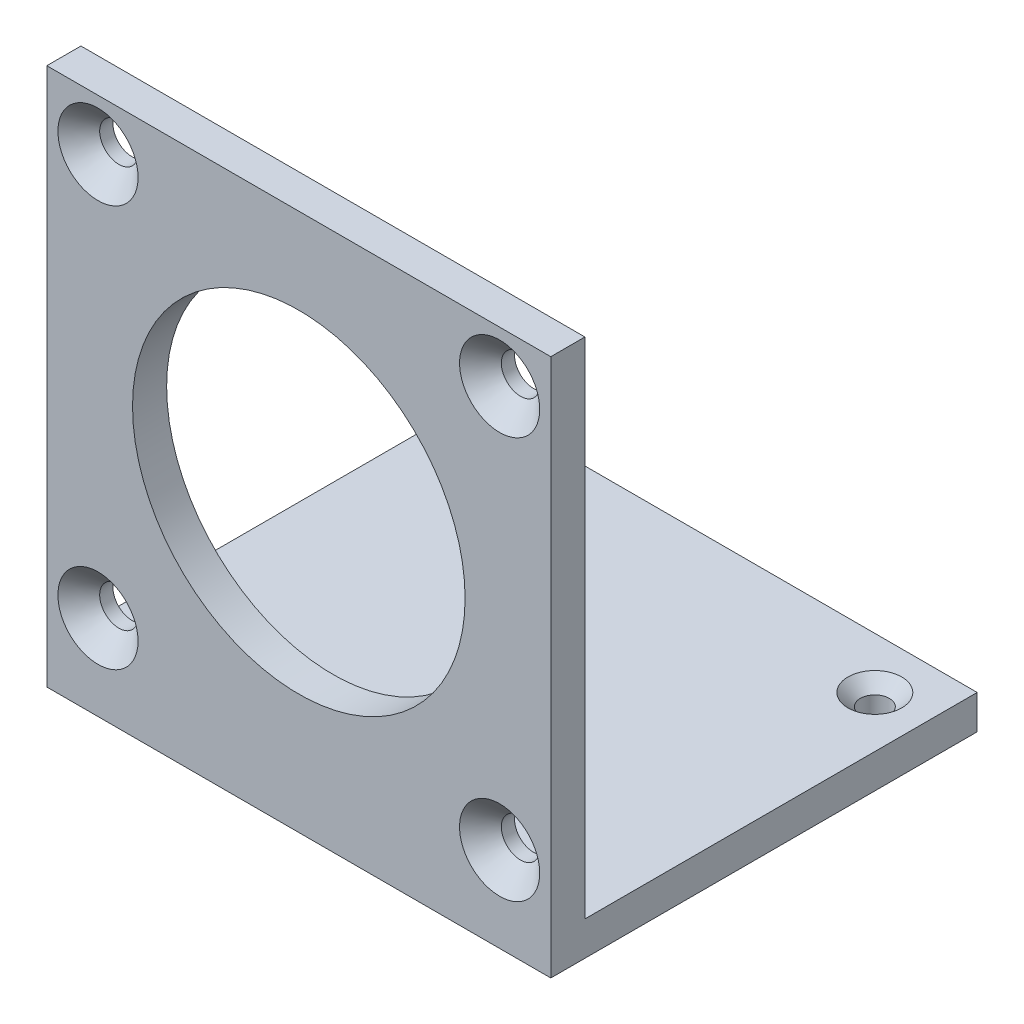
ISO-10303-21;
HEADER;
FILE_DESCRIPTION(('STEP AP214'),'2;1');
FILE_NAME('part.step','',(''),(''),'','','');
FILE_SCHEMA(('AUTOMOTIVE_DESIGN { 1 0 10303 214 1 1 1 1 }'));
ENDSEC;
DATA;
#1=APPLICATION_CONTEXT('core data for automotive mechanical design processes');
#2=APPLICATION_PROTOCOL_DEFINITION('international standard','automotive_design',2000,#1);
#3=PRODUCT_CONTEXT('',#1,'mechanical');
#4=PRODUCT('Part','Part','',(#3));
#5=PRODUCT_RELATED_PRODUCT_CATEGORY('part','',(#4));
#6=PRODUCT_DEFINITION_FORMATION('','',#4);
#7=PRODUCT_DEFINITION_CONTEXT('part definition',#1,'design');
#8=PRODUCT_DEFINITION('design','',#6,#7);
#9=PRODUCT_DEFINITION_SHAPE('','',#8);
#10=(LENGTH_UNIT() NAMED_UNIT(*) SI_UNIT(.MILLI.,.METRE.));
#11=(NAMED_UNIT(*) PLANE_ANGLE_UNIT() SI_UNIT($,.RADIAN.));
#12=(NAMED_UNIT(*) SI_UNIT($,.STERADIAN.) SOLID_ANGLE_UNIT());
#13=UNCERTAINTY_MEASURE_WITH_UNIT(LENGTH_MEASURE(1.E-05),#10,'distance_accuracy_value','');
#14=(GEOMETRIC_REPRESENTATION_CONTEXT(3) GLOBAL_UNCERTAINTY_ASSIGNED_CONTEXT((#13)) GLOBAL_UNIT_ASSIGNED_CONTEXT((#10,
#11,#12)) REPRESENTATION_CONTEXT('',''));
#15=CARTESIAN_POINT('',(0.,0.,0.));
#16=DIRECTION('',(0.,0.,1.));
#17=DIRECTION('',(1.,0.,0.));
#18=AXIS2_PLACEMENT_3D('',#15,#16,#17);
#19=CARTESIAN_POINT('',(0.,-10.,0.));
#20=DIRECTION('',(0.,-1.,0.));
#21=DIRECTION('',(0.,0.,-1.));
#22=AXIS2_PLACEMENT_3D('',#19,#20,#21);
#23=PLANE('',#22);
#24=CARTESIAN_POINT('',(47.1,-10.,-40.));
#25=DIRECTION('',(0.,1.,0.));
#26=DIRECTION('',(0.,0.,1.));
#27=AXIS2_PLACEMENT_3D('',#24,#25,#26);
#28=CIRCLE('',#27,1.7);
#29=CARTESIAN_POINT('',(47.1,-10.,-38.3));
#30=VERTEX_POINT('',#29);
#31=EDGE_CURVE('E145',#30,#30,#28,.T.);
#32=ORIENTED_EDGE('',*,*,#31,.T.);
#33=EDGE_LOOP('',(#32));
#34=FACE_BOUND('',#33,.T.);
#35=CARTESIAN_POINT('',(23.55,-10.,-18.));
#36=DIRECTION('',(0.,1.,0.));
#37=DIRECTION('',(0.,0.,1.));
#38=AXIS2_PLACEMENT_3D('',#35,#36,#37);
#39=CIRCLE('',#38,1.7);
#40=CARTESIAN_POINT('',(23.55,-10.,-16.3));
#41=VERTEX_POINT('',#40);
#42=EDGE_CURVE('E154',#41,#41,#39,.T.);
#43=ORIENTED_EDGE('',*,*,#42,.T.);
#44=EDGE_LOOP('',(#43));
#45=FACE_BOUND('',#44,.T.);
#46=DIRECTION('',(0.,0.,-1.));
#47=VECTOR('',#46,1.);
#48=CARTESIAN_POINT('',(-6.,-10.,4.));
#49=LINE('',#48,#47);
#50=CARTESIAN_POINT('',(-6.,-10.,4.));
#51=VERTEX_POINT('',#50);
#52=CARTESIAN_POINT('',(-5.99999999999999,-10.,-46.));
#53=VERTEX_POINT('',#52);
#54=EDGE_CURVE('E158',#51,#53,#49,.T.);
#55=ORIENTED_EDGE('',*,*,#54,.T.);
#56=DIRECTION('',(1.,0.,0.));
#57=VECTOR('',#56,1.);
#58=CARTESIAN_POINT('',(-5.99999999999999,-10.,-46.));
#59=LINE('',#58,#57);
#60=CARTESIAN_POINT('',(53.1,-10.,-46.));
#61=VERTEX_POINT('',#60);
#62=EDGE_CURVE('E161',#53,#61,#59,.T.);
#63=ORIENTED_EDGE('',*,*,#62,.T.);
#64=DIRECTION('',(0.,0.,1.));
#65=VECTOR('',#64,1.);
#66=CARTESIAN_POINT('',(53.1,-10.,4.));
#67=LINE('',#66,#65);
#68=CARTESIAN_POINT('',(53.1,-10.,4.));
#69=VERTEX_POINT('',#68);
#70=EDGE_CURVE('E165',#61,#69,#67,.T.);
#71=ORIENTED_EDGE('',*,*,#70,.T.);
#72=DIRECTION('',(-1.,0.,0.));
#73=VECTOR('',#72,1.);
#74=CARTESIAN_POINT('',(-6.,-10.,4.));
#75=LINE('',#74,#73);
#76=EDGE_CURVE('E168',#69,#51,#75,.T.);
#77=ORIENTED_EDGE('',*,*,#76,.T.);
#78=EDGE_LOOP('',(#55,#63,#71,#77));
#79=FACE_BOUND('',#78,.T.);
#80=CARTESIAN_POINT('',(0.,-10.,-40.));
#81=DIRECTION('',(0.,1.,0.));
#82=DIRECTION('',(0.,0.,1.));
#83=AXIS2_PLACEMENT_3D('',#80,#81,#82);
#84=CIRCLE('',#83,1.7);
#85=CARTESIAN_POINT('',(0.,-10.,-38.3));
#86=VERTEX_POINT('',#85);
#87=EDGE_CURVE('E136',#86,#86,#84,.T.);
#88=ORIENTED_EDGE('',*,*,#87,.T.);
#89=EDGE_LOOP('',(#88));
#90=FACE_BOUND('',#89,.T.);
#91=ADVANCED_FACE('F33',(#34,#45,#79,#90),#23,.T.);
#92=CARTESIAN_POINT('',(0.,0.,4.));
#93=DIRECTION('',(0.,0.,-1.));
#94=DIRECTION('',(-1.,0.,0.));
#95=AXIS2_PLACEMENT_3D('',#92,#93,#94);
#96=PLANE('',#95);
#97=CARTESIAN_POINT('',(0.,47.1,4.));
#98=DIRECTION('',(0.,0.,1.));
#99=DIRECTION('',(1.,0.,0.));
#100=AXIS2_PLACEMENT_3D('',#97,#98,#99);
#101=CIRCLE('',#100,4.7);
#102=CARTESIAN_POINT('',(4.7,47.1,4.));
#103=VERTEX_POINT('',#102);
#104=EDGE_CURVE('E461',#103,#103,#101,.T.);
#105=ORIENTED_EDGE('',*,*,#104,.F.);
#106=EDGE_LOOP('',(#105));
#107=FACE_BOUND('',#106,.T.);
#108=CARTESIAN_POINT('',(47.1,47.1,4.));
#109=DIRECTION('',(0.,0.,1.));
#110=DIRECTION('',(1.,0.,0.));
#111=AXIS2_PLACEMENT_3D('',#108,#109,#110);
#112=CIRCLE('',#111,4.7);
#113=CARTESIAN_POINT('',(51.8,47.1,4.));
#114=VERTEX_POINT('',#113);
#115=EDGE_CURVE('E117',#114,#114,#112,.T.);
#116=ORIENTED_EDGE('',*,*,#115,.F.);
#117=EDGE_LOOP('',(#116));
#118=FACE_BOUND('',#117,.T.);
#119=CARTESIAN_POINT('',(47.1,0.,4.));
#120=DIRECTION('',(0.,0.,1.));
#121=DIRECTION('',(1.,0.,0.));
#122=AXIS2_PLACEMENT_3D('',#119,#120,#121);
#123=CIRCLE('',#122,4.7);
#124=CARTESIAN_POINT('',(51.8,0.,4.));
#125=VERTEX_POINT('',#124);
#126=EDGE_CURVE('E110',#125,#125,#123,.T.);
#127=ORIENTED_EDGE('',*,*,#126,.F.);
#128=EDGE_LOOP('',(#127));
#129=FACE_BOUND('',#128,.T.);
#130=CARTESIAN_POINT('',(0.,0.,4.));
#131=DIRECTION('',(0.,0.,1.));
#132=DIRECTION('',(1.,0.,0.));
#133=AXIS2_PLACEMENT_3D('',#130,#131,#132);
#134=CIRCLE('',#133,4.7);
#135=CARTESIAN_POINT('',(4.7,0.,4.));
#136=VERTEX_POINT('',#135);
#137=EDGE_CURVE('E106',#136,#136,#134,.T.);
#138=ORIENTED_EDGE('',*,*,#137,.F.);
#139=EDGE_LOOP('',(#138));
#140=FACE_BOUND('',#139,.T.);
#141=DIRECTION('',(0.,-1.,0.));
#142=VECTOR('',#141,1.);
#143=CARTESIAN_POINT('',(-6.,-6.,4.));
#144=LINE('',#143,#142);
#145=CARTESIAN_POINT('',(-6.,53.1,4.));
#146=VERTEX_POINT('',#145);
#147=EDGE_CURVE('E76',#146,#51,#144,.T.);
#148=ORIENTED_EDGE('',*,*,#147,.T.);
#149=ORIENTED_EDGE('',*,*,#76,.F.);
#150=DIRECTION('',(0.,1.,0.));
#151=VECTOR('',#150,1.);
#152=CARTESIAN_POINT('',(53.1,-6.,4.));
#153=LINE('',#152,#151);
#154=CARTESIAN_POINT('',(53.1,53.1,4.));
#155=VERTEX_POINT('',#154);
#156=EDGE_CURVE('E184',#69,#155,#153,.T.);
#157=ORIENTED_EDGE('',*,*,#156,.T.);
#158=DIRECTION('',(-1.,0.,0.));
#159=VECTOR('',#158,1.);
#160=CARTESIAN_POINT('',(-6.,53.1,4.));
#161=LINE('',#160,#159);
#162=EDGE_CURVE('E52',#155,#146,#161,.T.);
#163=ORIENTED_EDGE('',*,*,#162,.T.);
#164=EDGE_LOOP('',(#148,#149,#157,#163));
#165=FACE_BOUND('',#164,.T.);
#166=CARTESIAN_POINT('',(23.55,23.55,4.));
#167=DIRECTION('',(0.,0.,1.));
#168=DIRECTION('',(1.,0.,0.));
#169=AXIS2_PLACEMENT_3D('',#166,#167,#168);
#170=CIRCLE('',#169,19.5);
#171=CARTESIAN_POINT('',(43.05,23.55,4.));
#172=VERTEX_POINT('',#171);
#173=EDGE_CURVE('E89',#172,#172,#170,.T.);
#174=ORIENTED_EDGE('',*,*,#173,.F.);
#175=EDGE_LOOP('',(#174));
#176=FACE_BOUND('',#175,.T.);
#177=ADVANCED_FACE('F187',(#107,#118,#129,#140,#165,#176),#96,.F.);
#178=CARTESIAN_POINT('',(0.,0.,0.));
#179=DIRECTION('',(0.,0.,-1.));
#180=DIRECTION('',(-1.,0.,0.));
#181=AXIS2_PLACEMENT_3D('',#178,#179,#180);
#182=PLANE('',#181);
#183=CARTESIAN_POINT('',(0.,47.1,0.));
#184=DIRECTION('',(0.,0.,-1.));
#185=DIRECTION('',(-1.,0.,0.));
#186=AXIS2_PLACEMENT_3D('',#183,#184,#185);
#187=CIRCLE('',#186,2.24999999999999);
#188=CARTESIAN_POINT('',(-2.24999999999999,47.1,0.));
#189=VERTEX_POINT('',#188);
#190=EDGE_CURVE('E37',#189,#189,#187,.T.);
#191=ORIENTED_EDGE('',*,*,#190,.F.);
#192=EDGE_LOOP('',(#191));
#193=FACE_BOUND('',#192,.T.);
#194=CARTESIAN_POINT('',(47.1,47.1,0.));
#195=DIRECTION('',(0.,0.,-1.));
#196=DIRECTION('',(-1.,0.,0.));
#197=AXIS2_PLACEMENT_3D('',#194,#195,#196);
#198=CIRCLE('',#197,2.24999999999999);
#199=CARTESIAN_POINT('',(44.85,47.1,0.));
#200=VERTEX_POINT('',#199);
#201=EDGE_CURVE('E108',#200,#200,#198,.T.);
#202=ORIENTED_EDGE('',*,*,#201,.F.);
#203=EDGE_LOOP('',(#202));
#204=FACE_BOUND('',#203,.T.);
#205=CARTESIAN_POINT('',(47.1,0.,0.));
#206=DIRECTION('',(0.,0.,-1.));
#207=DIRECTION('',(-1.,0.,0.));
#208=AXIS2_PLACEMENT_3D('',#205,#206,#207);
#209=CIRCLE('',#208,2.24999999999999);
#210=CARTESIAN_POINT('',(44.85,0.,0.));
#211=VERTEX_POINT('',#210);
#212=EDGE_CURVE('E104',#211,#211,#209,.T.);
#213=ORIENTED_EDGE('',*,*,#212,.F.);
#214=EDGE_LOOP('',(#213));
#215=FACE_BOUND('',#214,.T.);
#216=CARTESIAN_POINT('',(0.,0.,0.));
#217=DIRECTION('',(0.,0.,-1.));
#218=DIRECTION('',(-1.,0.,0.));
#219=AXIS2_PLACEMENT_3D('',#216,#217,#218);
#220=CIRCLE('',#219,2.24999999999999);
#221=CARTESIAN_POINT('',(-2.24999999999999,0.,0.));
#222=VERTEX_POINT('',#221);
#223=EDGE_CURVE('E99',#222,#222,#220,.T.);
#224=ORIENTED_EDGE('',*,*,#223,.F.);
#225=EDGE_LOOP('',(#224));
#226=FACE_BOUND('',#225,.T.);
#227=DIRECTION('',(0.,-1.,0.));
#228=VECTOR('',#227,1.);
#229=CARTESIAN_POINT('',(-6.,-6.,0.));
#230=LINE('',#229,#228);
#231=CARTESIAN_POINT('',(-6.,53.1,0.));
#232=VERTEX_POINT('',#231);
#233=CARTESIAN_POINT('',(-6.,-6.,0.));
#234=VERTEX_POINT('',#233);
#235=EDGE_CURVE('E81',#232,#234,#230,.T.);
#236=ORIENTED_EDGE('',*,*,#235,.F.);
#237=DIRECTION('',(-1.,0.,0.));
#238=VECTOR('',#237,1.);
#239=CARTESIAN_POINT('',(-6.,53.1,0.));
#240=LINE('',#239,#238);
#241=CARTESIAN_POINT('',(53.1,53.1,0.));
#242=VERTEX_POINT('',#241);
#243=EDGE_CURVE('E70',#242,#232,#240,.T.);
#244=ORIENTED_EDGE('',*,*,#243,.F.);
#245=DIRECTION('',(0.,1.,0.));
#246=VECTOR('',#245,1.);
#247=CARTESIAN_POINT('',(53.1,-6.,0.));
#248=LINE('',#247,#246);
#249=CARTESIAN_POINT('',(53.1,-6.,0.));
#250=VERTEX_POINT('',#249);
#251=EDGE_CURVE('E66',#250,#242,#248,.T.);
#252=ORIENTED_EDGE('',*,*,#251,.F.);
#253=DIRECTION('',(1.,0.,0.));
#254=VECTOR('',#253,1.);
#255=CARTESIAN_POINT('',(-6.,-6.,0.));
#256=LINE('',#255,#254);
#257=EDGE_CURVE('E88',#234,#250,#256,.T.);
#258=ORIENTED_EDGE('',*,*,#257,.F.);
#259=EDGE_LOOP('',(#236,#244,#252,#258));
#260=FACE_BOUND('',#259,.T.);
#261=CARTESIAN_POINT('',(23.55,23.55,0.));
#262=DIRECTION('',(0.,0.,1.));
#263=DIRECTION('',(1.,0.,0.));
#264=AXIS2_PLACEMENT_3D('',#261,#262,#263);
#265=CIRCLE('',#264,19.5);
#266=CARTESIAN_POINT('',(43.05,23.55,0.));
#267=VERTEX_POINT('',#266);
#268=EDGE_CURVE('E93',#267,#267,#265,.T.);
#269=ORIENTED_EDGE('',*,*,#268,.T.);
#270=EDGE_LOOP('',(#269));
#271=FACE_BOUND('',#270,.T.);
#272=ADVANCED_FACE('F85',(#193,#204,#215,#226,#260,#271),#182,.T.);
#273=CARTESIAN_POINT('',(-6.,-6.,4.));
#274=DIRECTION('',(1.,0.,0.));
#275=DIRECTION('',(0.,0.,-1.));
#276=AXIS2_PLACEMENT_3D('',#273,#274,#275);
#277=PLANE('',#276);
#278=ORIENTED_EDGE('',*,*,#235,.T.);
#279=DIRECTION('',(0.,0.,-1.));
#280=VECTOR('',#279,1.);
#281=CARTESIAN_POINT('',(-6.,-6.,4.));
#282=LINE('',#281,#280);
#283=CARTESIAN_POINT('',(-5.99999999999999,-6.,-46.));
#284=VERTEX_POINT('',#283);
#285=EDGE_CURVE('E157',#234,#284,#282,.T.);
#286=ORIENTED_EDGE('',*,*,#285,.T.);
#287=DIRECTION('',(0.,1.,0.));
#288=VECTOR('',#287,1.);
#289=CARTESIAN_POINT('',(-5.99999999999999,-10.,-46.));
#290=LINE('',#289,#288);
#291=EDGE_CURVE('E179',#53,#284,#290,.T.);
#292=ORIENTED_EDGE('',*,*,#291,.F.);
#293=ORIENTED_EDGE('',*,*,#54,.F.);
#294=ORIENTED_EDGE('',*,*,#147,.F.);
#295=DIRECTION('',(0.,0.,-1.));
#296=VECTOR('',#295,1.);
#297=CARTESIAN_POINT('',(-6.,53.1,4.));
#298=LINE('',#297,#296);
#299=EDGE_CURVE('E43',#146,#232,#298,.T.);
#300=ORIENTED_EDGE('',*,*,#299,.T.);
#301=EDGE_LOOP('',(#278,#286,#292,#293,#294,#300));
#302=FACE_BOUND('',#301,.T.);
#303=ADVANCED_FACE('F35',(#302),#277,.F.);
#304=CARTESIAN_POINT('',(53.1,-6.,4.));
#305=DIRECTION('',(-1.,0.,0.));
#306=DIRECTION('',(0.,0.,1.));
#307=AXIS2_PLACEMENT_3D('',#304,#305,#306);
#308=PLANE('',#307);
#309=ORIENTED_EDGE('',*,*,#251,.T.);
#310=DIRECTION('',(0.,0.,-1.));
#311=VECTOR('',#310,1.);
#312=CARTESIAN_POINT('',(53.1,53.1,4.));
#313=LINE('',#312,#311);
#314=EDGE_CURVE('E11',#155,#242,#313,.T.);
#315=ORIENTED_EDGE('',*,*,#314,.F.);
#316=ORIENTED_EDGE('',*,*,#156,.F.);
#317=ORIENTED_EDGE('',*,*,#70,.F.);
#318=DIRECTION('',(0.,1.,0.));
#319=VECTOR('',#318,1.);
#320=CARTESIAN_POINT('',(53.1,-10.,-46.));
#321=LINE('',#320,#319);
#322=CARTESIAN_POINT('',(53.1,-6.,-46.));
#323=VERTEX_POINT('',#322);
#324=EDGE_CURVE('E171',#61,#323,#321,.T.);
#325=ORIENTED_EDGE('',*,*,#324,.T.);
#326=DIRECTION('',(0.,0.,1.));
#327=VECTOR('',#326,1.);
#328=CARTESIAN_POINT('',(53.1,-6.,4.));
#329=LINE('',#328,#327);
#330=EDGE_CURVE('E162',#323,#250,#329,.T.);
#331=ORIENTED_EDGE('',*,*,#330,.T.);
#332=EDGE_LOOP('',(#309,#315,#316,#317,#325,#331));
#333=FACE_BOUND('',#332,.T.);
#334=ADVANCED_FACE('F191',(#333),#308,.F.);
#335=CARTESIAN_POINT('',(-6.,53.1,4.));
#336=DIRECTION('',(0.,-1.,0.));
#337=DIRECTION('',(0.,0.,-1.));
#338=AXIS2_PLACEMENT_3D('',#335,#336,#337);
#339=PLANE('',#338);
#340=ORIENTED_EDGE('',*,*,#243,.T.);
#341=ORIENTED_EDGE('',*,*,#299,.F.);
#342=ORIENTED_EDGE('',*,*,#162,.F.);
#343=ORIENTED_EDGE('',*,*,#314,.T.);
#344=EDGE_LOOP('',(#340,#341,#342,#343));
#345=FACE_BOUND('',#344,.T.);
#346=ADVANCED_FACE('F72',(#345),#339,.F.);
#347=CARTESIAN_POINT('',(23.55,23.55,4.));
#348=DIRECTION('',(0.,0.,-1.));
#349=DIRECTION('',(-1.,0.,0.));
#350=AXIS2_PLACEMENT_3D('',#347,#348,#349);
#351=CYLINDRICAL_SURFACE('',#350,19.5);
#352=ORIENTED_EDGE('',*,*,#173,.T.);
#353=EDGE_LOOP('',(#352));
#354=FACE_BOUND('',#353,.T.);
#355=ORIENTED_EDGE('',*,*,#268,.F.);
#356=EDGE_LOOP('',(#355));
#357=FACE_BOUND('',#356,.T.);
#358=ADVANCED_FACE('F197',(#354,#357),#351,.F.);
#359=CARTESIAN_POINT('',(0.,-6.,0.));
#360=DIRECTION('',(0.,-1.,0.));
#361=DIRECTION('',(0.,0.,-1.));
#362=AXIS2_PLACEMENT_3D('',#359,#360,#361);
#363=PLANE('',#362);
#364=CARTESIAN_POINT('',(0.,-6.,-40.));
#365=DIRECTION('',(0.,1.,0.));
#366=DIRECTION('',(0.,0.,1.));
#367=AXIS2_PLACEMENT_3D('',#364,#365,#366);
#368=CIRCLE('',#367,3.15);
#369=CARTESIAN_POINT('',(0.,-6.,-36.85));
#370=VERTEX_POINT('',#369);
#371=EDGE_CURVE('E102',#370,#370,#368,.T.);
#372=ORIENTED_EDGE('',*,*,#371,.F.);
#373=EDGE_LOOP('',(#372));
#374=FACE_BOUND('',#373,.T.);
#375=CARTESIAN_POINT('',(47.1,-6.,-40.));
#376=DIRECTION('',(0.,1.,0.));
#377=DIRECTION('',(0.,0.,1.));
#378=AXIS2_PLACEMENT_3D('',#375,#376,#377);
#379=CIRCLE('',#378,3.15);
#380=CARTESIAN_POINT('',(47.1,-6.,-36.85));
#381=VERTEX_POINT('',#380);
#382=EDGE_CURVE('E139',#381,#381,#379,.T.);
#383=ORIENTED_EDGE('',*,*,#382,.F.);
#384=EDGE_LOOP('',(#383));
#385=FACE_BOUND('',#384,.T.);
#386=CARTESIAN_POINT('',(23.55,-6.,-18.));
#387=DIRECTION('',(0.,1.,0.));
#388=DIRECTION('',(0.,0.,1.));
#389=AXIS2_PLACEMENT_3D('',#386,#387,#388);
#390=CIRCLE('',#389,3.15);
#391=CARTESIAN_POINT('',(23.55,-6.,-14.85));
#392=VERTEX_POINT('',#391);
#393=EDGE_CURVE('E148',#392,#392,#390,.T.);
#394=ORIENTED_EDGE('',*,*,#393,.F.);
#395=EDGE_LOOP('',(#394));
#396=FACE_BOUND('',#395,.T.);
#397=ORIENTED_EDGE('',*,*,#285,.F.);
#398=ORIENTED_EDGE('',*,*,#257,.T.);
#399=ORIENTED_EDGE('',*,*,#330,.F.);
#400=DIRECTION('',(1.,0.,0.));
#401=VECTOR('',#400,1.);
#402=CARTESIAN_POINT('',(-5.99999999999999,-6.,-46.));
#403=LINE('',#402,#401);
#404=EDGE_CURVE('E173',#284,#323,#403,.T.);
#405=ORIENTED_EDGE('',*,*,#404,.F.);
#406=EDGE_LOOP('',(#397,#398,#399,#405));
#407=FACE_BOUND('',#406,.T.);
#408=ADVANCED_FACE('F212',(#374,#385,#396,#407),#363,.F.);
#409=CARTESIAN_POINT('',(-5.99999999999999,-10.,-46.));
#410=DIRECTION('',(0.,0.,1.));
#411=DIRECTION('',(1.,0.,0.));
#412=AXIS2_PLACEMENT_3D('',#409,#410,#411);
#413=PLANE('',#412);
#414=ORIENTED_EDGE('',*,*,#404,.T.);
#415=ORIENTED_EDGE('',*,*,#324,.F.);
#416=ORIENTED_EDGE('',*,*,#62,.F.);
#417=ORIENTED_EDGE('',*,*,#291,.T.);
#418=EDGE_LOOP('',(#414,#415,#416,#417));
#419=FACE_BOUND('',#418,.T.);
#420=ADVANCED_FACE('F215',(#419),#413,.F.);
#421=CARTESIAN_POINT('',(23.55,-6.,-18.));
#422=DIRECTION('',(0.,1.,0.));
#423=DIRECTION('',(0.,0.,1.));
#424=AXIS2_PLACEMENT_3D('',#421,#422,#423);
#425=CYLINDRICAL_SURFACE('',#424,1.7);
#426=ORIENTED_EDGE('',*,*,#42,.F.);
#427=EDGE_LOOP('',(#426));
#428=FACE_BOUND('',#427,.T.);
#429=CARTESIAN_POINT('',(23.55,-7.45,-18.));
#430=DIRECTION('',(0.,1.,0.));
#431=DIRECTION('',(0.,0.,1.));
#432=AXIS2_PLACEMENT_3D('',#429,#430,#431);
#433=CIRCLE('',#432,1.7);
#434=CARTESIAN_POINT('',(23.55,-7.45,-16.3));
#435=VERTEX_POINT('',#434);
#436=EDGE_CURVE('E151',#435,#435,#433,.T.);
#437=ORIENTED_EDGE('',*,*,#436,.T.);
#438=EDGE_LOOP('',(#437));
#439=FACE_BOUND('',#438,.T.);
#440=ADVANCED_FACE('F210',(#428,#439),#425,.F.);
#441=CARTESIAN_POINT('',(23.55,-6.,-18.));
#442=DIRECTION('',(0.,1.,0.));
#443=DIRECTION('',(0.,0.,1.));
#444=AXIS2_PLACEMENT_3D('',#441,#442,#443);
#445=CONICAL_SURFACE('',#444,3.15,0.785398163397448);
#446=ORIENTED_EDGE('',*,*,#436,.F.);
#447=EDGE_LOOP('',(#446));
#448=FACE_BOUND('',#447,.T.);
#449=ORIENTED_EDGE('',*,*,#393,.T.);
#450=EDGE_LOOP('',(#449));
#451=FACE_BOUND('',#450,.T.);
#452=ADVANCED_FACE('F270',(#448,#451),#445,.F.);
#453=CARTESIAN_POINT('',(47.1,-6.,-40.));
#454=DIRECTION('',(0.,1.,0.));
#455=DIRECTION('',(0.,0.,1.));
#456=AXIS2_PLACEMENT_3D('',#453,#454,#455);
#457=CYLINDRICAL_SURFACE('',#456,1.7);
#458=ORIENTED_EDGE('',*,*,#31,.F.);
#459=EDGE_LOOP('',(#458));
#460=FACE_BOUND('',#459,.T.);
#461=CARTESIAN_POINT('',(47.1,-7.45,-40.));
#462=DIRECTION('',(0.,1.,0.));
#463=DIRECTION('',(0.,0.,1.));
#464=AXIS2_PLACEMENT_3D('',#461,#462,#463);
#465=CIRCLE('',#464,1.7);
#466=CARTESIAN_POINT('',(47.1,-7.45,-38.3));
#467=VERTEX_POINT('',#466);
#468=EDGE_CURVE('E142',#467,#467,#465,.T.);
#469=ORIENTED_EDGE('',*,*,#468,.T.);
#470=EDGE_LOOP('',(#469));
#471=FACE_BOUND('',#470,.T.);
#472=ADVANCED_FACE('F267',(#460,#471),#457,.F.);
#473=CARTESIAN_POINT('',(47.1,-6.,-40.));
#474=DIRECTION('',(0.,1.,0.));
#475=DIRECTION('',(0.,0.,1.));
#476=AXIS2_PLACEMENT_3D('',#473,#474,#475);
#477=CONICAL_SURFACE('',#476,3.15,0.785398163397448);
#478=ORIENTED_EDGE('',*,*,#468,.F.);
#479=EDGE_LOOP('',(#478));
#480=FACE_BOUND('',#479,.T.);
#481=ORIENTED_EDGE('',*,*,#382,.T.);
#482=EDGE_LOOP('',(#481));
#483=FACE_BOUND('',#482,.T.);
#484=ADVANCED_FACE('F263',(#480,#483),#477,.F.);
#485=CARTESIAN_POINT('',(0.,-6.,-40.));
#486=DIRECTION('',(0.,1.,0.));
#487=DIRECTION('',(0.,0.,1.));
#488=AXIS2_PLACEMENT_3D('',#485,#486,#487);
#489=CYLINDRICAL_SURFACE('',#488,1.7);
#490=ORIENTED_EDGE('',*,*,#87,.F.);
#491=EDGE_LOOP('',(#490));
#492=FACE_BOUND('',#491,.T.);
#493=CARTESIAN_POINT('',(0.,-7.45,-40.));
#494=DIRECTION('',(0.,1.,0.));
#495=DIRECTION('',(0.,0.,1.));
#496=AXIS2_PLACEMENT_3D('',#493,#494,#495);
#497=CIRCLE('',#496,1.7);
#498=CARTESIAN_POINT('',(0.,-7.45,-38.3));
#499=VERTEX_POINT('',#498);
#500=EDGE_CURVE('E133',#499,#499,#497,.T.);
#501=ORIENTED_EDGE('',*,*,#500,.T.);
#502=EDGE_LOOP('',(#501));
#503=FACE_BOUND('',#502,.T.);
#504=ADVANCED_FACE('F259',(#492,#503),#489,.F.);
#505=CARTESIAN_POINT('',(0.,-6.,-40.));
#506=DIRECTION('',(0.,1.,0.));
#507=DIRECTION('',(0.,0.,1.));
#508=AXIS2_PLACEMENT_3D('',#505,#506,#507);
#509=CONICAL_SURFACE('',#508,3.15,0.785398163397448);
#510=ORIENTED_EDGE('',*,*,#500,.F.);
#511=EDGE_LOOP('',(#510));
#512=FACE_BOUND('',#511,.T.);
#513=ORIENTED_EDGE('',*,*,#371,.T.);
#514=EDGE_LOOP('',(#513));
#515=FACE_BOUND('',#514,.T.);
#516=ADVANCED_FACE('F239',(#512,#515),#509,.F.);
#517=CARTESIAN_POINT('',(0.,0.,4.));
#518=DIRECTION('',(0.,0.,1.));
#519=DIRECTION('',(1.,0.,0.));
#520=AXIS2_PLACEMENT_3D('',#517,#518,#519);
#521=CYLINDRICAL_SURFACE('',#520,2.24999999999999);
#522=ORIENTED_EDGE('',*,*,#223,.T.);
#523=EDGE_LOOP('',(#522));
#524=FACE_BOUND('',#523,.T.);
#525=CARTESIAN_POINT('',(0.,0.,1.55000000000001));
#526=DIRECTION('',(0.,0.,1.));
#527=DIRECTION('',(1.,0.,0.));
#528=AXIS2_PLACEMENT_3D('',#525,#526,#527);
#529=CIRCLE('',#528,2.24999999999999);
#530=CARTESIAN_POINT('',(2.24999999999999,0.,1.55000000000001));
#531=VERTEX_POINT('',#530);
#532=EDGE_CURVE('E103',#531,#531,#529,.T.);
#533=ORIENTED_EDGE('',*,*,#532,.T.);
#534=EDGE_LOOP('',(#533));
#535=FACE_BOUND('',#534,.T.);
#536=ADVANCED_FACE('F235',(#524,#535),#521,.F.);
#537=CARTESIAN_POINT('',(0.,0.,4.));
#538=DIRECTION('',(0.,0.,1.));
#539=DIRECTION('',(1.,0.,0.));
#540=AXIS2_PLACEMENT_3D('',#537,#538,#539);
#541=CONICAL_SURFACE('',#540,4.7,0.785398163397451);
#542=ORIENTED_EDGE('',*,*,#532,.F.);
#543=EDGE_LOOP('',(#542));
#544=FACE_BOUND('',#543,.T.);
#545=ORIENTED_EDGE('',*,*,#137,.T.);
#546=EDGE_LOOP('',(#545));
#547=FACE_BOUND('',#546,.T.);
#548=ADVANCED_FACE('F238',(#544,#547),#541,.F.);
#549=CARTESIAN_POINT('',(47.1,0.,4.));
#550=DIRECTION('',(0.,0.,1.));
#551=DIRECTION('',(1.,0.,0.));
#552=AXIS2_PLACEMENT_3D('',#549,#550,#551);
#553=CYLINDRICAL_SURFACE('',#552,2.24999999999999);
#554=ORIENTED_EDGE('',*,*,#212,.T.);
#555=EDGE_LOOP('',(#554));
#556=FACE_BOUND('',#555,.T.);
#557=CARTESIAN_POINT('',(47.1,0.,1.55000000000001));
#558=DIRECTION('',(0.,0.,1.));
#559=DIRECTION('',(1.,0.,0.));
#560=AXIS2_PLACEMENT_3D('',#557,#558,#559);
#561=CIRCLE('',#560,2.25);
#562=CARTESIAN_POINT('',(49.35,0.,1.55000000000001));
#563=VERTEX_POINT('',#562);
#564=EDGE_CURVE('E107',#563,#563,#561,.T.);
#565=ORIENTED_EDGE('',*,*,#564,.T.);
#566=EDGE_LOOP('',(#565));
#567=FACE_BOUND('',#566,.T.);
#568=ADVANCED_FACE('F245',(#556,#567),#553,.F.);
#569=CARTESIAN_POINT('',(47.1,0.,4.));
#570=DIRECTION('',(0.,0.,1.));
#571=DIRECTION('',(1.,0.,0.));
#572=AXIS2_PLACEMENT_3D('',#569,#570,#571);
#573=CONICAL_SURFACE('',#572,4.7,0.785398163397451);
#574=ORIENTED_EDGE('',*,*,#564,.F.);
#575=EDGE_LOOP('',(#574));
#576=FACE_BOUND('',#575,.T.);
#577=ORIENTED_EDGE('',*,*,#126,.T.);
#578=EDGE_LOOP('',(#577));
#579=FACE_BOUND('',#578,.T.);
#580=ADVANCED_FACE('F252',(#576,#579),#573,.F.);
#581=CARTESIAN_POINT('',(47.1,47.1,4.));
#582=DIRECTION('',(0.,0.,1.));
#583=DIRECTION('',(1.,0.,0.));
#584=AXIS2_PLACEMENT_3D('',#581,#582,#583);
#585=CYLINDRICAL_SURFACE('',#584,2.24999999999999);
#586=ORIENTED_EDGE('',*,*,#201,.T.);
#587=EDGE_LOOP('',(#586));
#588=FACE_BOUND('',#587,.T.);
#589=CARTESIAN_POINT('',(47.1,47.1,1.55000000000001));
#590=DIRECTION('',(0.,0.,1.));
#591=DIRECTION('',(1.,0.,0.));
#592=AXIS2_PLACEMENT_3D('',#589,#590,#591);
#593=CIRCLE('',#592,2.25);
#594=CARTESIAN_POINT('',(49.35,47.1,1.55000000000001));
#595=VERTEX_POINT('',#594);
#596=EDGE_CURVE('E111',#595,#595,#593,.T.);
#597=ORIENTED_EDGE('',*,*,#596,.T.);
#598=EDGE_LOOP('',(#597));
#599=FACE_BOUND('',#598,.T.);
#600=ADVANCED_FACE('F413',(#588,#599),#585,.F.);
#601=CARTESIAN_POINT('',(47.1,47.1,4.));
#602=DIRECTION('',(0.,0.,1.));
#603=DIRECTION('',(1.,0.,0.));
#604=AXIS2_PLACEMENT_3D('',#601,#602,#603);
#605=CONICAL_SURFACE('',#604,4.7,0.785398163397451);
#606=ORIENTED_EDGE('',*,*,#596,.F.);
#607=EDGE_LOOP('',(#606));
#608=FACE_BOUND('',#607,.T.);
#609=ORIENTED_EDGE('',*,*,#115,.T.);
#610=EDGE_LOOP('',(#609));
#611=FACE_BOUND('',#610,.T.);
#612=ADVANCED_FACE('F421',(#608,#611),#605,.F.);
#613=CARTESIAN_POINT('',(0.,47.1,4.));
#614=DIRECTION('',(0.,0.,1.));
#615=DIRECTION('',(1.,0.,0.));
#616=AXIS2_PLACEMENT_3D('',#613,#614,#615);
#617=CYLINDRICAL_SURFACE('',#616,2.24999999999999);
#618=ORIENTED_EDGE('',*,*,#190,.T.);
#619=EDGE_LOOP('',(#618));
#620=FACE_BOUND('',#619,.T.);
#621=CARTESIAN_POINT('',(0.,47.1,1.55000000000001));
#622=DIRECTION('',(0.,0.,1.));
#623=DIRECTION('',(1.,0.,0.));
#624=AXIS2_PLACEMENT_3D('',#621,#622,#623);
#625=CIRCLE('',#624,2.24999999999999);
#626=CARTESIAN_POINT('',(2.24999999999999,47.1,1.55000000000001));
#627=VERTEX_POINT('',#626);
#628=EDGE_CURVE('E458',#627,#627,#625,.T.);
#629=ORIENTED_EDGE('',*,*,#628,.T.);
#630=EDGE_LOOP('',(#629));
#631=FACE_BOUND('',#630,.T.);
#632=ADVANCED_FACE('F429',(#620,#631),#617,.F.);
#633=CARTESIAN_POINT('',(0.,47.1,4.));
#634=DIRECTION('',(0.,0.,1.));
#635=DIRECTION('',(1.,0.,0.));
#636=AXIS2_PLACEMENT_3D('',#633,#634,#635);
#637=CONICAL_SURFACE('',#636,4.7,0.785398163397451);
#638=ORIENTED_EDGE('',*,*,#628,.F.);
#639=EDGE_LOOP('',(#638));
#640=FACE_BOUND('',#639,.T.);
#641=ORIENTED_EDGE('',*,*,#104,.T.);
#642=EDGE_LOOP('',(#641));
#643=FACE_BOUND('',#642,.T.);
#644=ADVANCED_FACE('F438',(#640,#643),#637,.F.);
#645=CLOSED_SHELL('',(#91,#177,#272,#303,#334,#346,#358,#408,#420,#440,#452,#472,#484,#504,#516,
#536,#548,#568,#580,#600,#612,#632,#644));
#646=MANIFOLD_SOLID_BREP('B2',#645);
#647=ADVANCED_BREP_SHAPE_REPRESENTATION('',(#18,#646),#14);
#648=SHAPE_DEFINITION_REPRESENTATION(#9,#647);
ENDSEC;
END-ISO-10303-21;
